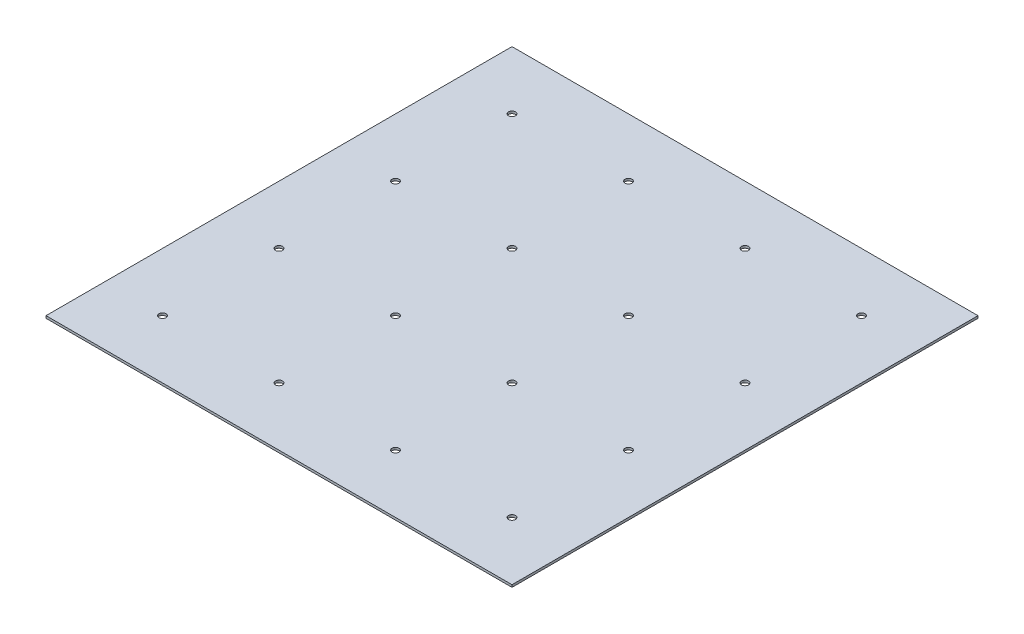
ISO-10303-21;
HEADER;
FILE_DESCRIPTION(('STEP AP214'),'2;1');
FILE_NAME('part.step','',(''),(''),'','','');
FILE_SCHEMA(('AUTOMOTIVE_DESIGN { 1 0 10303 214 1 1 1 1 }'));
ENDSEC;
DATA;
#1=APPLICATION_CONTEXT('core data for automotive mechanical design processes');
#2=APPLICATION_PROTOCOL_DEFINITION('international standard','automotive_design',2000,#1);
#3=PRODUCT_CONTEXT('',#1,'mechanical');
#4=PRODUCT('Part','Part','',(#3));
#5=PRODUCT_RELATED_PRODUCT_CATEGORY('part','',(#4));
#6=PRODUCT_DEFINITION_FORMATION('','',#4);
#7=PRODUCT_DEFINITION_CONTEXT('part definition',#1,'design');
#8=PRODUCT_DEFINITION('design','',#6,#7);
#9=PRODUCT_DEFINITION_SHAPE('','',#8);
#10=(LENGTH_UNIT() NAMED_UNIT(*) SI_UNIT(.MILLI.,.METRE.));
#11=(NAMED_UNIT(*) PLANE_ANGLE_UNIT() SI_UNIT($,.RADIAN.));
#12=(NAMED_UNIT(*) SI_UNIT($,.STERADIAN.) SOLID_ANGLE_UNIT());
#13=UNCERTAINTY_MEASURE_WITH_UNIT(LENGTH_MEASURE(1.E-05),#10,'distance_accuracy_value','');
#14=(GEOMETRIC_REPRESENTATION_CONTEXT(3) GLOBAL_UNCERTAINTY_ASSIGNED_CONTEXT((#13)) GLOBAL_UNIT_ASSIGNED_CONTEXT((#10,
#11,#12)) REPRESENTATION_CONTEXT('',''));
#15=CARTESIAN_POINT('',(0.,0.,0.));
#16=DIRECTION('',(0.,0.,1.));
#17=DIRECTION('',(1.,0.,0.));
#18=AXIS2_PLACEMENT_3D('',#15,#16,#17);
#19=CARTESIAN_POINT('',(200.,2.,-200.));
#20=DIRECTION('',(-1.,0.,0.));
#21=DIRECTION('',(0.,0.,1.));
#22=AXIS2_PLACEMENT_3D('',#19,#20,#21);
#23=PLANE('',#22);
#24=DIRECTION('',(0.,0.,-1.));
#25=VECTOR('',#24,1.);
#26=CARTESIAN_POINT('',(200.,0.,-200.));
#27=LINE('',#26,#25);
#28=CARTESIAN_POINT('',(200.,0.,200.));
#29=VERTEX_POINT('',#28);
#30=CARTESIAN_POINT('',(200.,0.,-200.));
#31=VERTEX_POINT('',#30);
#32=EDGE_CURVE('E99',#29,#31,#27,.T.);
#33=ORIENTED_EDGE('',*,*,#32,.T.);
#34=DIRECTION('',(0.,-1.,0.));
#35=VECTOR('',#34,1.);
#36=CARTESIAN_POINT('',(200.,2.,-200.));
#37=LINE('',#36,#35);
#38=CARTESIAN_POINT('',(200.,2.,-200.));
#39=VERTEX_POINT('',#38);
#40=EDGE_CURVE('E11',#39,#31,#37,.T.);
#41=ORIENTED_EDGE('',*,*,#40,.F.);
#42=DIRECTION('',(0.,0.,-1.));
#43=VECTOR('',#42,1.);
#44=CARTESIAN_POINT('',(200.,2.,-200.));
#45=LINE('',#44,#43);
#46=CARTESIAN_POINT('',(200.,2.,200.));
#47=VERTEX_POINT('',#46);
#48=EDGE_CURVE('E87',#47,#39,#45,.T.);
#49=ORIENTED_EDGE('',*,*,#48,.F.);
#50=DIRECTION('',(0.,-1.,0.));
#51=VECTOR('',#50,1.);
#52=CARTESIAN_POINT('',(200.,2.,200.));
#53=LINE('',#52,#51);
#54=EDGE_CURVE('E95',#47,#29,#53,.T.);
#55=ORIENTED_EDGE('',*,*,#54,.T.);
#56=EDGE_LOOP('',(#33,#41,#49,#55));
#57=FACE_BOUND('',#56,.T.);
#58=ADVANCED_FACE('F36',(#57),#23,.F.);
#59=CARTESIAN_POINT('',(-200.,2.,-200.));
#60=DIRECTION('',(0.,0.,1.));
#61=DIRECTION('',(1.,0.,0.));
#62=AXIS2_PLACEMENT_3D('',#59,#60,#61);
#63=PLANE('',#62);
#64=DIRECTION('',(-1.,0.,0.));
#65=VECTOR('',#64,1.);
#66=CARTESIAN_POINT('',(-200.,0.,-200.));
#67=LINE('',#66,#65);
#68=CARTESIAN_POINT('',(-200.,0.,-200.));
#69=VERTEX_POINT('',#68);
#70=EDGE_CURVE('E91',#31,#69,#67,.T.);
#71=ORIENTED_EDGE('',*,*,#70,.T.);
#72=DIRECTION('',(0.,-1.,0.));
#73=VECTOR('',#72,1.);
#74=CARTESIAN_POINT('',(-200.,2.,-200.));
#75=LINE('',#74,#73);
#76=CARTESIAN_POINT('',(-200.,2.,-200.));
#77=VERTEX_POINT('',#76);
#78=EDGE_CURVE('E44',#77,#69,#75,.T.);
#79=ORIENTED_EDGE('',*,*,#78,.F.);
#80=DIRECTION('',(-1.,0.,0.));
#81=VECTOR('',#80,1.);
#82=CARTESIAN_POINT('',(-200.,2.,-200.));
#83=LINE('',#82,#81);
#84=EDGE_CURVE('E82',#39,#77,#83,.T.);
#85=ORIENTED_EDGE('',*,*,#84,.F.);
#86=ORIENTED_EDGE('',*,*,#40,.T.);
#87=EDGE_LOOP('',(#71,#79,#85,#86));
#88=FACE_BOUND('',#87,.T.);
#89=ADVANCED_FACE('F90',(#88),#63,.F.);
#90=CARTESIAN_POINT('',(-200.,2.,-200.));
#91=DIRECTION('',(1.,0.,0.));
#92=DIRECTION('',(0.,0.,-1.));
#93=AXIS2_PLACEMENT_3D('',#90,#91,#92);
#94=PLANE('',#93);
#95=DIRECTION('',(0.,0.,1.));
#96=VECTOR('',#95,1.);
#97=CARTESIAN_POINT('',(-200.,0.,-200.));
#98=LINE('',#97,#96);
#99=CARTESIAN_POINT('',(-200.,0.,200.));
#100=VERTEX_POINT('',#99);
#101=EDGE_CURVE('E69',#69,#100,#98,.T.);
#102=ORIENTED_EDGE('',*,*,#101,.T.);
#103=DIRECTION('',(0.,-1.,0.));
#104=VECTOR('',#103,1.);
#105=CARTESIAN_POINT('',(-200.,2.,200.));
#106=LINE('',#105,#104);
#107=CARTESIAN_POINT('',(-200.,2.,200.));
#108=VERTEX_POINT('',#107);
#109=EDGE_CURVE('E92',#108,#100,#106,.T.);
#110=ORIENTED_EDGE('',*,*,#109,.F.);
#111=DIRECTION('',(0.,0.,1.));
#112=VECTOR('',#111,1.);
#113=CARTESIAN_POINT('',(-200.,2.,-200.));
#114=LINE('',#113,#112);
#115=EDGE_CURVE('E85',#77,#108,#114,.T.);
#116=ORIENTED_EDGE('',*,*,#115,.F.);
#117=ORIENTED_EDGE('',*,*,#78,.T.);
#118=EDGE_LOOP('',(#102,#110,#116,#117));
#119=FACE_BOUND('',#118,.T.);
#120=ADVANCED_FACE('F93',(#119),#94,.F.);
#121=CARTESIAN_POINT('',(-200.,2.,200.));
#122=DIRECTION('',(0.,0.,-1.));
#123=DIRECTION('',(-1.,0.,0.));
#124=AXIS2_PLACEMENT_3D('',#121,#122,#123);
#125=PLANE('',#124);
#126=DIRECTION('',(1.,0.,0.));
#127=VECTOR('',#126,1.);
#128=CARTESIAN_POINT('',(-200.,0.,200.));
#129=LINE('',#128,#127);
#130=EDGE_CURVE('E75',#100,#29,#129,.T.);
#131=ORIENTED_EDGE('',*,*,#130,.T.);
#132=ORIENTED_EDGE('',*,*,#54,.F.);
#133=DIRECTION('',(1.,0.,0.));
#134=VECTOR('',#133,1.);
#135=CARTESIAN_POINT('',(-200.,2.,200.));
#136=LINE('',#135,#134);
#137=EDGE_CURVE('E52',#108,#47,#136,.T.);
#138=ORIENTED_EDGE('',*,*,#137,.F.);
#139=ORIENTED_EDGE('',*,*,#109,.T.);
#140=EDGE_LOOP('',(#131,#132,#138,#139));
#141=FACE_BOUND('',#140,.T.);
#142=ADVANCED_FACE('F107',(#141),#125,.F.);
#143=CARTESIAN_POINT('',(0.,2.,0.));
#144=DIRECTION('',(0.,1.,0.));
#145=DIRECTION('',(0.,0.,1.));
#146=AXIS2_PLACEMENT_3D('',#143,#144,#145);
#147=PLANE('',#146);
#148=CARTESIAN_POINT('',(50.0000000000021,2.,50.));
#149=DIRECTION('',(0.,1.,0.));
#150=DIRECTION('',(0.,0.,1.));
#151=AXIS2_PLACEMENT_3D('',#148,#149,#150);
#152=CIRCLE('',#151,2.99999999999999);
#153=CARTESIAN_POINT('',(50.0000000000021,2.,53.));
#154=VERTEX_POINT('',#153);
#155=EDGE_CURVE('E143',#154,#154,#152,.T.);
#156=ORIENTED_EDGE('',*,*,#155,.F.);
#157=EDGE_LOOP('',(#156));
#158=FACE_BOUND('',#157,.T.);
#159=CARTESIAN_POINT('',(-49.9999999999979,2.,50.));
#160=DIRECTION('',(0.,1.,0.));
#161=DIRECTION('',(0.,0.,1.));
#162=AXIS2_PLACEMENT_3D('',#159,#160,#161);
#163=CIRCLE('',#162,2.99999999999999);
#164=CARTESIAN_POINT('',(-49.9999999999979,2.,53.));
#165=VERTEX_POINT('',#164);
#166=EDGE_CURVE('E150',#165,#165,#163,.T.);
#167=ORIENTED_EDGE('',*,*,#166,.F.);
#168=EDGE_LOOP('',(#167));
#169=FACE_BOUND('',#168,.T.);
#170=CARTESIAN_POINT('',(150.000000000001,2.,-50.));
#171=DIRECTION('',(0.,1.,0.));
#172=DIRECTION('',(0.,0.,1.));
#173=AXIS2_PLACEMENT_3D('',#170,#171,#172);
#174=CIRCLE('',#173,2.99999999999999);
#175=CARTESIAN_POINT('',(150.000000000001,2.,-47.));
#176=VERTEX_POINT('',#175);
#177=EDGE_CURVE('E156',#176,#176,#174,.T.);
#178=ORIENTED_EDGE('',*,*,#177,.F.);
#179=EDGE_LOOP('',(#178));
#180=FACE_BOUND('',#179,.T.);
#181=CARTESIAN_POINT('',(50.000000000001,2.,-50.));
#182=DIRECTION('',(0.,1.,0.));
#183=DIRECTION('',(0.,0.,1.));
#184=AXIS2_PLACEMENT_3D('',#181,#182,#183);
#185=CIRCLE('',#184,2.99999999999999);
#186=CARTESIAN_POINT('',(50.000000000001,2.,-47.));
#187=VERTEX_POINT('',#186);
#188=EDGE_CURVE('E162',#187,#187,#185,.T.);
#189=ORIENTED_EDGE('',*,*,#188,.F.);
#190=EDGE_LOOP('',(#189));
#191=FACE_BOUND('',#190,.T.);
#192=CARTESIAN_POINT('',(-50.,2.,-150.));
#193=DIRECTION('',(0.,1.,0.));
#194=DIRECTION('',(0.,0.,1.));
#195=AXIS2_PLACEMENT_3D('',#192,#193,#194);
#196=CIRCLE('',#195,2.99999999999999);
#197=CARTESIAN_POINT('',(-50.,2.,-147.));
#198=VERTEX_POINT('',#197);
#199=EDGE_CURVE('E126',#198,#198,#196,.T.);
#200=ORIENTED_EDGE('',*,*,#199,.F.);
#201=EDGE_LOOP('',(#200));
#202=FACE_BOUND('',#201,.T.);
#203=CARTESIAN_POINT('',(50.,2.,-150.));
#204=DIRECTION('',(0.,1.,0.));
#205=DIRECTION('',(0.,0.,1.));
#206=AXIS2_PLACEMENT_3D('',#203,#204,#205);
#207=CIRCLE('',#206,2.99999999999999);
#208=CARTESIAN_POINT('',(50.,2.,-147.));
#209=VERTEX_POINT('',#208);
#210=EDGE_CURVE('E119',#209,#209,#207,.T.);
#211=ORIENTED_EDGE('',*,*,#210,.F.);
#212=EDGE_LOOP('',(#211));
#213=FACE_BOUND('',#212,.T.);
#214=CARTESIAN_POINT('',(150.,2.,-150.));
#215=DIRECTION('',(0.,1.,0.));
#216=DIRECTION('',(0.,0.,1.));
#217=AXIS2_PLACEMENT_3D('',#214,#215,#216);
#218=CIRCLE('',#217,2.99999999999999);
#219=CARTESIAN_POINT('',(150.,2.,-147.));
#220=VERTEX_POINT('',#219);
#221=EDGE_CURVE('E138',#220,#220,#218,.T.);
#222=ORIENTED_EDGE('',*,*,#221,.F.);
#223=EDGE_LOOP('',(#222));
#224=FACE_BOUND('',#223,.T.);
#225=CARTESIAN_POINT('',(-49.999999999999,2.,-50.));
#226=DIRECTION('',(0.,1.,0.));
#227=DIRECTION('',(0.,0.,1.));
#228=AXIS2_PLACEMENT_3D('',#225,#226,#227);
#229=CIRCLE('',#228,2.99999999999999);
#230=CARTESIAN_POINT('',(-49.999999999999,2.,-47.));
#231=VERTEX_POINT('',#230);
#232=EDGE_CURVE('E131',#231,#231,#229,.T.);
#233=ORIENTED_EDGE('',*,*,#232,.F.);
#234=EDGE_LOOP('',(#233));
#235=FACE_BOUND('',#234,.T.);
#236=CARTESIAN_POINT('',(150.000000000003,2.,150.));
#237=DIRECTION('',(0.,1.,0.));
#238=DIRECTION('',(0.,0.,1.));
#239=AXIS2_PLACEMENT_3D('',#236,#237,#238);
#240=CIRCLE('',#239,2.99999999999999);
#241=CARTESIAN_POINT('',(150.000000000003,2.,153.));
#242=VERTEX_POINT('',#241);
#243=EDGE_CURVE('E185',#242,#242,#240,.T.);
#244=ORIENTED_EDGE('',*,*,#243,.F.);
#245=EDGE_LOOP('',(#244));
#246=FACE_BOUND('',#245,.T.);
#247=CARTESIAN_POINT('',(50.0000000000031,2.,150.));
#248=DIRECTION('',(0.,1.,0.));
#249=DIRECTION('',(0.,0.,1.));
#250=AXIS2_PLACEMENT_3D('',#247,#248,#249);
#251=CIRCLE('',#250,2.99999999999999);
#252=CARTESIAN_POINT('',(50.0000000000031,2.,153.));
#253=VERTEX_POINT('',#252);
#254=EDGE_CURVE('E203',#253,#253,#251,.T.);
#255=ORIENTED_EDGE('',*,*,#254,.F.);
#256=EDGE_LOOP('',(#255));
#257=FACE_BOUND('',#256,.T.);
#258=CARTESIAN_POINT('',(-49.9999999999969,2.,150.));
#259=DIRECTION('',(0.,1.,0.));
#260=DIRECTION('',(0.,0.,1.));
#261=AXIS2_PLACEMENT_3D('',#258,#259,#260);
#262=CIRCLE('',#261,2.99999999999999);
#263=CARTESIAN_POINT('',(-49.9999999999969,2.,153.));
#264=VERTEX_POINT('',#263);
#265=EDGE_CURVE('E186',#264,#264,#262,.T.);
#266=ORIENTED_EDGE('',*,*,#265,.F.);
#267=EDGE_LOOP('',(#266));
#268=FACE_BOUND('',#267,.T.);
#269=CARTESIAN_POINT('',(150.000000000002,2.,50.));
#270=DIRECTION('',(0.,1.,0.));
#271=DIRECTION('',(0.,0.,1.));
#272=AXIS2_PLACEMENT_3D('',#269,#270,#271);
#273=CIRCLE('',#272,2.99999999999999);
#274=CARTESIAN_POINT('',(150.000000000002,2.,53.));
#275=VERTEX_POINT('',#274);
#276=EDGE_CURVE('E193',#275,#275,#273,.T.);
#277=ORIENTED_EDGE('',*,*,#276,.F.);
#278=EDGE_LOOP('',(#277));
#279=FACE_BOUND('',#278,.T.);
#280=CARTESIAN_POINT('',(-149.999999999999,2.,-50.));
#281=DIRECTION('',(0.,1.,0.));
#282=DIRECTION('',(0.,0.,1.));
#283=AXIS2_PLACEMENT_3D('',#280,#281,#282);
#284=CIRCLE('',#283,2.99999999999999);
#285=CARTESIAN_POINT('',(-149.999999999999,2.,-47.));
#286=VERTEX_POINT('',#285);
#287=EDGE_CURVE('E179',#286,#286,#284,.T.);
#288=ORIENTED_EDGE('',*,*,#287,.F.);
#289=EDGE_LOOP('',(#288));
#290=FACE_BOUND('',#289,.T.);
#291=CARTESIAN_POINT('',(-149.999999999998,2.,50.));
#292=DIRECTION('',(0.,1.,0.));
#293=DIRECTION('',(0.,0.,1.));
#294=AXIS2_PLACEMENT_3D('',#291,#292,#293);
#295=CIRCLE('',#294,2.99999999999999);
#296=CARTESIAN_POINT('',(-149.999999999998,2.,53.));
#297=VERTEX_POINT('',#296);
#298=EDGE_CURVE('E173',#297,#297,#295,.T.);
#299=ORIENTED_EDGE('',*,*,#298,.F.);
#300=EDGE_LOOP('',(#299));
#301=FACE_BOUND('',#300,.T.);
#302=CARTESIAN_POINT('',(-149.999999999997,2.,150.));
#303=DIRECTION('',(0.,1.,0.));
#304=DIRECTION('',(0.,0.,1.));
#305=AXIS2_PLACEMENT_3D('',#302,#303,#304);
#306=CIRCLE('',#305,2.99999999999999);
#307=CARTESIAN_POINT('',(-149.999999999997,2.,153.));
#308=VERTEX_POINT('',#307);
#309=EDGE_CURVE('E167',#308,#308,#306,.T.);
#310=ORIENTED_EDGE('',*,*,#309,.F.);
#311=EDGE_LOOP('',(#310));
#312=FACE_BOUND('',#311,.T.);
#313=CARTESIAN_POINT('',(-150.,2.,-150.));
#314=DIRECTION('',(0.,1.,0.));
#315=DIRECTION('',(0.,0.,1.));
#316=AXIS2_PLACEMENT_3D('',#313,#314,#315);
#317=CIRCLE('',#316,2.99999999999999);
#318=CARTESIAN_POINT('',(-150.,2.,-147.));
#319=VERTEX_POINT('',#318);
#320=EDGE_CURVE('E113',#319,#319,#317,.T.);
#321=ORIENTED_EDGE('',*,*,#320,.F.);
#322=EDGE_LOOP('',(#321));
#323=FACE_BOUND('',#322,.T.);
#324=ORIENTED_EDGE('',*,*,#48,.T.);
#325=ORIENTED_EDGE('',*,*,#84,.T.);
#326=ORIENTED_EDGE('',*,*,#115,.T.);
#327=ORIENTED_EDGE('',*,*,#137,.T.);
#328=EDGE_LOOP('',(#324,#325,#326,#327));
#329=FACE_BOUND('',#328,.T.);
#330=ADVANCED_FACE('F83',(#158,#169,#180,#191,#202,#213,#224,#235,#246,#257,#268,#279,#290,#301,
#312,#323,#329),#147,.T.);
#331=CARTESIAN_POINT('',(0.,0.,0.));
#332=DIRECTION('',(0.,1.,0.));
#333=DIRECTION('',(0.,0.,1.));
#334=AXIS2_PLACEMENT_3D('',#331,#332,#333);
#335=PLANE('',#334);
#336=CARTESIAN_POINT('',(50.0000000000021,0.,50.));
#337=DIRECTION('',(0.,1.,0.));
#338=DIRECTION('',(0.,0.,1.));
#339=AXIS2_PLACEMENT_3D('',#336,#337,#338);
#340=CIRCLE('',#339,2.99999999999999);
#341=CARTESIAN_POINT('',(50.0000000000021,0.,53.));
#342=VERTEX_POINT('',#341);
#343=EDGE_CURVE('E146',#342,#342,#340,.T.);
#344=ORIENTED_EDGE('',*,*,#343,.T.);
#345=EDGE_LOOP('',(#344));
#346=FACE_BOUND('',#345,.T.);
#347=CARTESIAN_POINT('',(-49.9999999999979,0.,50.));
#348=DIRECTION('',(0.,1.,0.));
#349=DIRECTION('',(0.,0.,1.));
#350=AXIS2_PLACEMENT_3D('',#347,#348,#349);
#351=CIRCLE('',#350,2.99999999999999);
#352=CARTESIAN_POINT('',(-49.9999999999979,0.,53.));
#353=VERTEX_POINT('',#352);
#354=EDGE_CURVE('E153',#353,#353,#351,.T.);
#355=ORIENTED_EDGE('',*,*,#354,.T.);
#356=EDGE_LOOP('',(#355));
#357=FACE_BOUND('',#356,.T.);
#358=CARTESIAN_POINT('',(150.000000000001,0.,-50.));
#359=DIRECTION('',(0.,1.,0.));
#360=DIRECTION('',(0.,0.,1.));
#361=AXIS2_PLACEMENT_3D('',#358,#359,#360);
#362=CIRCLE('',#361,2.99999999999999);
#363=CARTESIAN_POINT('',(150.000000000001,0.,-47.));
#364=VERTEX_POINT('',#363);
#365=EDGE_CURVE('E159',#364,#364,#362,.T.);
#366=ORIENTED_EDGE('',*,*,#365,.T.);
#367=EDGE_LOOP('',(#366));
#368=FACE_BOUND('',#367,.T.);
#369=CARTESIAN_POINT('',(50.000000000001,0.,-50.));
#370=DIRECTION('',(0.,1.,0.));
#371=DIRECTION('',(0.,0.,1.));
#372=AXIS2_PLACEMENT_3D('',#369,#370,#371);
#373=CIRCLE('',#372,2.99999999999999);
#374=CARTESIAN_POINT('',(50.000000000001,0.,-47.));
#375=VERTEX_POINT('',#374);
#376=EDGE_CURVE('E135',#375,#375,#373,.T.);
#377=ORIENTED_EDGE('',*,*,#376,.T.);
#378=EDGE_LOOP('',(#377));
#379=FACE_BOUND('',#378,.T.);
#380=CARTESIAN_POINT('',(-50.,0.,-150.));
#381=DIRECTION('',(0.,1.,0.));
#382=DIRECTION('',(0.,0.,1.));
#383=AXIS2_PLACEMENT_3D('',#380,#381,#382);
#384=CIRCLE('',#383,2.99999999999999);
#385=CARTESIAN_POINT('',(-50.,0.,-147.));
#386=VERTEX_POINT('',#385);
#387=EDGE_CURVE('E116',#386,#386,#384,.T.);
#388=ORIENTED_EDGE('',*,*,#387,.T.);
#389=EDGE_LOOP('',(#388));
#390=FACE_BOUND('',#389,.T.);
#391=CARTESIAN_POINT('',(50.,0.,-150.));
#392=DIRECTION('',(0.,1.,0.));
#393=DIRECTION('',(0.,0.,1.));
#394=AXIS2_PLACEMENT_3D('',#391,#392,#393);
#395=CIRCLE('',#394,2.99999999999999);
#396=CARTESIAN_POINT('',(50.,0.,-147.));
#397=VERTEX_POINT('',#396);
#398=EDGE_CURVE('E122',#397,#397,#395,.T.);
#399=ORIENTED_EDGE('',*,*,#398,.T.);
#400=EDGE_LOOP('',(#399));
#401=FACE_BOUND('',#400,.T.);
#402=CARTESIAN_POINT('',(150.,0.,-150.));
#403=DIRECTION('',(0.,1.,0.));
#404=DIRECTION('',(0.,0.,1.));
#405=AXIS2_PLACEMENT_3D('',#402,#403,#404);
#406=CIRCLE('',#405,2.99999999999999);
#407=CARTESIAN_POINT('',(150.,0.,-147.));
#408=VERTEX_POINT('',#407);
#409=EDGE_CURVE('E123',#408,#408,#406,.T.);
#410=ORIENTED_EDGE('',*,*,#409,.T.);
#411=EDGE_LOOP('',(#410));
#412=FACE_BOUND('',#411,.T.);
#413=CARTESIAN_POINT('',(-49.999999999999,0.,-50.));
#414=DIRECTION('',(0.,1.,0.));
#415=DIRECTION('',(0.,0.,1.));
#416=AXIS2_PLACEMENT_3D('',#413,#414,#415);
#417=CIRCLE('',#416,2.99999999999999);
#418=CARTESIAN_POINT('',(-49.999999999999,0.,-47.));
#419=VERTEX_POINT('',#418);
#420=EDGE_CURVE('E134',#419,#419,#417,.T.);
#421=ORIENTED_EDGE('',*,*,#420,.T.);
#422=EDGE_LOOP('',(#421));
#423=FACE_BOUND('',#422,.T.);
#424=CARTESIAN_POINT('',(150.000000000003,0.,150.));
#425=DIRECTION('',(0.,1.,0.));
#426=DIRECTION('',(0.,0.,1.));
#427=AXIS2_PLACEMENT_3D('',#424,#425,#426);
#428=CIRCLE('',#427,2.99999999999999);
#429=CARTESIAN_POINT('',(150.000000000003,0.,153.));
#430=VERTEX_POINT('',#429);
#431=EDGE_CURVE('E200',#430,#430,#428,.T.);
#432=ORIENTED_EDGE('',*,*,#431,.T.);
#433=EDGE_LOOP('',(#432));
#434=FACE_BOUND('',#433,.T.);
#435=CARTESIAN_POINT('',(50.0000000000031,0.,150.));
#436=DIRECTION('',(0.,1.,0.));
#437=DIRECTION('',(0.,0.,1.));
#438=AXIS2_PLACEMENT_3D('',#435,#436,#437);
#439=CIRCLE('',#438,2.99999999999999);
#440=CARTESIAN_POINT('',(50.0000000000031,0.,153.));
#441=VERTEX_POINT('',#440);
#442=EDGE_CURVE('E190',#441,#441,#439,.T.);
#443=ORIENTED_EDGE('',*,*,#442,.T.);
#444=EDGE_LOOP('',(#443));
#445=FACE_BOUND('',#444,.T.);
#446=CARTESIAN_POINT('',(-49.9999999999969,0.,150.));
#447=DIRECTION('',(0.,1.,0.));
#448=DIRECTION('',(0.,0.,1.));
#449=AXIS2_PLACEMENT_3D('',#446,#447,#448);
#450=CIRCLE('',#449,2.99999999999999);
#451=CARTESIAN_POINT('',(-49.9999999999969,0.,153.));
#452=VERTEX_POINT('',#451);
#453=EDGE_CURVE('E189',#452,#452,#450,.T.);
#454=ORIENTED_EDGE('',*,*,#453,.T.);
#455=EDGE_LOOP('',(#454));
#456=FACE_BOUND('',#455,.T.);
#457=CARTESIAN_POINT('',(150.000000000002,0.,50.));
#458=DIRECTION('',(0.,1.,0.));
#459=DIRECTION('',(0.,0.,1.));
#460=AXIS2_PLACEMENT_3D('',#457,#458,#459);
#461=CIRCLE('',#460,2.99999999999999);
#462=CARTESIAN_POINT('',(150.000000000002,0.,53.));
#463=VERTEX_POINT('',#462);
#464=EDGE_CURVE('E147',#463,#463,#461,.T.);
#465=ORIENTED_EDGE('',*,*,#464,.T.);
#466=EDGE_LOOP('',(#465));
#467=FACE_BOUND('',#466,.T.);
#468=CARTESIAN_POINT('',(-149.999999999999,0.,-50.));
#469=DIRECTION('',(0.,1.,0.));
#470=DIRECTION('',(0.,0.,1.));
#471=AXIS2_PLACEMENT_3D('',#468,#469,#470);
#472=CIRCLE('',#471,2.99999999999999);
#473=CARTESIAN_POINT('',(-149.999999999999,0.,-47.));
#474=VERTEX_POINT('',#473);
#475=EDGE_CURVE('E182',#474,#474,#472,.T.);
#476=ORIENTED_EDGE('',*,*,#475,.T.);
#477=EDGE_LOOP('',(#476));
#478=FACE_BOUND('',#477,.T.);
#479=CARTESIAN_POINT('',(-149.999999999998,0.,50.));
#480=DIRECTION('',(0.,1.,0.));
#481=DIRECTION('',(0.,0.,1.));
#482=AXIS2_PLACEMENT_3D('',#479,#480,#481);
#483=CIRCLE('',#482,2.99999999999999);
#484=CARTESIAN_POINT('',(-149.999999999998,0.,53.));
#485=VERTEX_POINT('',#484);
#486=EDGE_CURVE('E176',#485,#485,#483,.T.);
#487=ORIENTED_EDGE('',*,*,#486,.T.);
#488=EDGE_LOOP('',(#487));
#489=FACE_BOUND('',#488,.T.);
#490=CARTESIAN_POINT('',(-149.999999999997,0.,150.));
#491=DIRECTION('',(0.,1.,0.));
#492=DIRECTION('',(0.,0.,1.));
#493=AXIS2_PLACEMENT_3D('',#490,#491,#492);
#494=CIRCLE('',#493,2.99999999999999);
#495=CARTESIAN_POINT('',(-149.999999999997,0.,153.));
#496=VERTEX_POINT('',#495);
#497=EDGE_CURVE('E170',#496,#496,#494,.T.);
#498=ORIENTED_EDGE('',*,*,#497,.T.);
#499=EDGE_LOOP('',(#498));
#500=FACE_BOUND('',#499,.T.);
#501=CARTESIAN_POINT('',(-150.,0.,-150.));
#502=DIRECTION('',(0.,1.,0.));
#503=DIRECTION('',(0.,0.,1.));
#504=AXIS2_PLACEMENT_3D('',#501,#502,#503);
#505=CIRCLE('',#504,2.99999999999999);
#506=CARTESIAN_POINT('',(-150.,0.,-147.));
#507=VERTEX_POINT('',#506);
#508=EDGE_CURVE('E102',#507,#507,#505,.T.);
#509=ORIENTED_EDGE('',*,*,#508,.T.);
#510=EDGE_LOOP('',(#509));
#511=FACE_BOUND('',#510,.T.);
#512=ORIENTED_EDGE('',*,*,#32,.F.);
#513=ORIENTED_EDGE('',*,*,#130,.F.);
#514=ORIENTED_EDGE('',*,*,#101,.F.);
#515=ORIENTED_EDGE('',*,*,#70,.F.);
#516=EDGE_LOOP('',(#512,#513,#514,#515));
#517=FACE_BOUND('',#516,.T.);
#518=ADVANCED_FACE('F110',(#346,#357,#368,#379,#390,#401,#412,#423,#434,#445,#456,#467,#478,
#489,#500,#511,#517),#335,.F.);
#519=CARTESIAN_POINT('',(-150.,0.,-150.));
#520=DIRECTION('',(0.,1.,0.));
#521=DIRECTION('',(0.,0.,1.));
#522=AXIS2_PLACEMENT_3D('',#519,#520,#521);
#523=CYLINDRICAL_SURFACE('',#522,2.99999999999999);
#524=ORIENTED_EDGE('',*,*,#508,.F.);
#525=EDGE_LOOP('',(#524));
#526=FACE_BOUND('',#525,.T.);
#527=ORIENTED_EDGE('',*,*,#320,.T.);
#528=EDGE_LOOP('',(#527));
#529=FACE_BOUND('',#528,.T.);
#530=ADVANCED_FACE('F235',(#526,#529),#523,.F.);
#531=CARTESIAN_POINT('',(-149.999999999997,0.,150.));
#532=DIRECTION('',(0.,1.,0.));
#533=DIRECTION('',(0.,0.,1.));
#534=AXIS2_PLACEMENT_3D('',#531,#532,#533);
#535=CYLINDRICAL_SURFACE('',#534,2.99999999999999);
#536=ORIENTED_EDGE('',*,*,#497,.F.);
#537=EDGE_LOOP('',(#536));
#538=FACE_BOUND('',#537,.T.);
#539=ORIENTED_EDGE('',*,*,#309,.T.);
#540=EDGE_LOOP('',(#539));
#541=FACE_BOUND('',#540,.T.);
#542=ADVANCED_FACE('F237',(#538,#541),#535,.F.);
#543=CARTESIAN_POINT('',(-149.999999999998,0.,50.));
#544=DIRECTION('',(0.,1.,0.));
#545=DIRECTION('',(0.,0.,1.));
#546=AXIS2_PLACEMENT_3D('',#543,#544,#545);
#547=CYLINDRICAL_SURFACE('',#546,2.99999999999999);
#548=ORIENTED_EDGE('',*,*,#486,.F.);
#549=EDGE_LOOP('',(#548));
#550=FACE_BOUND('',#549,.T.);
#551=ORIENTED_EDGE('',*,*,#298,.T.);
#552=EDGE_LOOP('',(#551));
#553=FACE_BOUND('',#552,.T.);
#554=ADVANCED_FACE('F244',(#550,#553),#547,.F.);
#555=CARTESIAN_POINT('',(-149.999999999999,0.,-50.));
#556=DIRECTION('',(0.,1.,0.));
#557=DIRECTION('',(0.,0.,1.));
#558=AXIS2_PLACEMENT_3D('',#555,#556,#557);
#559=CYLINDRICAL_SURFACE('',#558,2.99999999999999);
#560=ORIENTED_EDGE('',*,*,#475,.F.);
#561=EDGE_LOOP('',(#560));
#562=FACE_BOUND('',#561,.T.);
#563=ORIENTED_EDGE('',*,*,#287,.T.);
#564=EDGE_LOOP('',(#563));
#565=FACE_BOUND('',#564,.T.);
#566=ADVANCED_FACE('F292',(#562,#565),#559,.F.);
#567=CARTESIAN_POINT('',(150.000000000002,0.,50.));
#568=DIRECTION('',(0.,1.,0.));
#569=DIRECTION('',(0.,0.,1.));
#570=AXIS2_PLACEMENT_3D('',#567,#568,#569);
#571=CYLINDRICAL_SURFACE('',#570,2.99999999999999);
#572=ORIENTED_EDGE('',*,*,#464,.F.);
#573=EDGE_LOOP('',(#572));
#574=FACE_BOUND('',#573,.T.);
#575=ORIENTED_EDGE('',*,*,#276,.T.);
#576=EDGE_LOOP('',(#575));
#577=FACE_BOUND('',#576,.T.);
#578=ADVANCED_FACE('F302',(#574,#577),#571,.F.);
#579=CARTESIAN_POINT('',(-49.9999999999969,0.,150.));
#580=DIRECTION('',(0.,1.,0.));
#581=DIRECTION('',(0.,0.,1.));
#582=AXIS2_PLACEMENT_3D('',#579,#580,#581);
#583=CYLINDRICAL_SURFACE('',#582,2.99999999999999);
#584=ORIENTED_EDGE('',*,*,#453,.F.);
#585=EDGE_LOOP('',(#584));
#586=FACE_BOUND('',#585,.T.);
#587=ORIENTED_EDGE('',*,*,#265,.T.);
#588=EDGE_LOOP('',(#587));
#589=FACE_BOUND('',#588,.T.);
#590=ADVANCED_FACE('F215',(#586,#589),#583,.F.);
#591=CARTESIAN_POINT('',(50.0000000000031,0.,150.));
#592=DIRECTION('',(0.,1.,0.));
#593=DIRECTION('',(0.,0.,1.));
#594=AXIS2_PLACEMENT_3D('',#591,#592,#593);
#595=CYLINDRICAL_SURFACE('',#594,2.99999999999999);
#596=ORIENTED_EDGE('',*,*,#442,.F.);
#597=EDGE_LOOP('',(#596));
#598=FACE_BOUND('',#597,.T.);
#599=ORIENTED_EDGE('',*,*,#254,.T.);
#600=EDGE_LOOP('',(#599));
#601=FACE_BOUND('',#600,.T.);
#602=ADVANCED_FACE('F211',(#598,#601),#595,.F.);
#603=CARTESIAN_POINT('',(150.000000000003,0.,150.));
#604=DIRECTION('',(0.,1.,0.));
#605=DIRECTION('',(0.,0.,1.));
#606=AXIS2_PLACEMENT_3D('',#603,#604,#605);
#607=CYLINDRICAL_SURFACE('',#606,2.99999999999999);
#608=ORIENTED_EDGE('',*,*,#431,.F.);
#609=EDGE_LOOP('',(#608));
#610=FACE_BOUND('',#609,.T.);
#611=ORIENTED_EDGE('',*,*,#243,.T.);
#612=EDGE_LOOP('',(#611));
#613=FACE_BOUND('',#612,.T.);
#614=ADVANCED_FACE('F214',(#610,#613),#607,.F.);
#615=CARTESIAN_POINT('',(-49.999999999999,0.,-50.));
#616=DIRECTION('',(0.,1.,0.));
#617=DIRECTION('',(0.,0.,1.));
#618=AXIS2_PLACEMENT_3D('',#615,#616,#617);
#619=CYLINDRICAL_SURFACE('',#618,2.99999999999999);
#620=ORIENTED_EDGE('',*,*,#420,.F.);
#621=EDGE_LOOP('',(#620));
#622=FACE_BOUND('',#621,.T.);
#623=ORIENTED_EDGE('',*,*,#232,.T.);
#624=EDGE_LOOP('',(#623));
#625=FACE_BOUND('',#624,.T.);
#626=ADVANCED_FACE('F336',(#622,#625),#619,.F.);
#627=CARTESIAN_POINT('',(150.,0.,-150.));
#628=DIRECTION('',(0.,1.,0.));
#629=DIRECTION('',(0.,0.,1.));
#630=AXIS2_PLACEMENT_3D('',#627,#628,#629);
#631=CYLINDRICAL_SURFACE('',#630,2.99999999999999);
#632=ORIENTED_EDGE('',*,*,#409,.F.);
#633=EDGE_LOOP('',(#632));
#634=FACE_BOUND('',#633,.T.);
#635=ORIENTED_EDGE('',*,*,#221,.T.);
#636=EDGE_LOOP('',(#635));
#637=FACE_BOUND('',#636,.T.);
#638=ADVANCED_FACE('F346',(#634,#637),#631,.F.);
#639=CARTESIAN_POINT('',(50.,0.,-150.));
#640=DIRECTION('',(0.,1.,0.));
#641=DIRECTION('',(0.,0.,1.));
#642=AXIS2_PLACEMENT_3D('',#639,#640,#641);
#643=CYLINDRICAL_SURFACE('',#642,2.99999999999999);
#644=ORIENTED_EDGE('',*,*,#398,.F.);
#645=EDGE_LOOP('',(#644));
#646=FACE_BOUND('',#645,.T.);
#647=ORIENTED_EDGE('',*,*,#210,.T.);
#648=EDGE_LOOP('',(#647));
#649=FACE_BOUND('',#648,.T.);
#650=ADVANCED_FACE('F356',(#646,#649),#643,.F.);
#651=CARTESIAN_POINT('',(-50.,0.,-150.));
#652=DIRECTION('',(0.,1.,0.));
#653=DIRECTION('',(0.,0.,1.));
#654=AXIS2_PLACEMENT_3D('',#651,#652,#653);
#655=CYLINDRICAL_SURFACE('',#654,2.99999999999999);
#656=ORIENTED_EDGE('',*,*,#387,.F.);
#657=EDGE_LOOP('',(#656));
#658=FACE_BOUND('',#657,.T.);
#659=ORIENTED_EDGE('',*,*,#199,.T.);
#660=EDGE_LOOP('',(#659));
#661=FACE_BOUND('',#660,.T.);
#662=ADVANCED_FACE('F366',(#658,#661),#655,.F.);
#663=CARTESIAN_POINT('',(50.000000000001,0.,-50.));
#664=DIRECTION('',(0.,1.,0.));
#665=DIRECTION('',(0.,0.,1.));
#666=AXIS2_PLACEMENT_3D('',#663,#664,#665);
#667=CYLINDRICAL_SURFACE('',#666,2.99999999999999);
#668=ORIENTED_EDGE('',*,*,#376,.F.);
#669=EDGE_LOOP('',(#668));
#670=FACE_BOUND('',#669,.T.);
#671=ORIENTED_EDGE('',*,*,#188,.T.);
#672=EDGE_LOOP('',(#671));
#673=FACE_BOUND('',#672,.T.);
#674=ADVANCED_FACE('F375',(#670,#673),#667,.F.);
#675=CARTESIAN_POINT('',(150.000000000001,0.,-50.));
#676=DIRECTION('',(0.,1.,0.));
#677=DIRECTION('',(0.,0.,1.));
#678=AXIS2_PLACEMENT_3D('',#675,#676,#677);
#679=CYLINDRICAL_SURFACE('',#678,2.99999999999999);
#680=ORIENTED_EDGE('',*,*,#365,.F.);
#681=EDGE_LOOP('',(#680));
#682=FACE_BOUND('',#681,.T.);
#683=ORIENTED_EDGE('',*,*,#177,.T.);
#684=EDGE_LOOP('',(#683));
#685=FACE_BOUND('',#684,.T.);
#686=ADVANCED_FACE('F385',(#682,#685),#679,.F.);
#687=CARTESIAN_POINT('',(-49.9999999999979,0.,50.));
#688=DIRECTION('',(0.,1.,0.));
#689=DIRECTION('',(0.,0.,1.));
#690=AXIS2_PLACEMENT_3D('',#687,#688,#689);
#691=CYLINDRICAL_SURFACE('',#690,2.99999999999999);
#692=ORIENTED_EDGE('',*,*,#354,.F.);
#693=EDGE_LOOP('',(#692));
#694=FACE_BOUND('',#693,.T.);
#695=ORIENTED_EDGE('',*,*,#166,.T.);
#696=EDGE_LOOP('',(#695));
#697=FACE_BOUND('',#696,.T.);
#698=ADVANCED_FACE('F395',(#694,#697),#691,.F.);
#699=CARTESIAN_POINT('',(50.0000000000021,0.,50.));
#700=DIRECTION('',(0.,1.,0.));
#701=DIRECTION('',(0.,0.,1.));
#702=AXIS2_PLACEMENT_3D('',#699,#700,#701);
#703=CYLINDRICAL_SURFACE('',#702,2.99999999999999);
#704=ORIENTED_EDGE('',*,*,#343,.F.);
#705=EDGE_LOOP('',(#704));
#706=FACE_BOUND('',#705,.T.);
#707=ORIENTED_EDGE('',*,*,#155,.T.);
#708=EDGE_LOOP('',(#707));
#709=FACE_BOUND('',#708,.T.);
#710=ADVANCED_FACE('F405',(#706,#709),#703,.F.);
#711=CLOSED_SHELL('',(#58,#89,#120,#142,#330,#518,#530,#542,#554,#566,#578,#590,#602,#614,#626,
#638,#650,#662,#674,#686,#698,#710));
#712=MANIFOLD_SOLID_BREP('B2',#711);
#713=ADVANCED_BREP_SHAPE_REPRESENTATION('',(#18,#712),#14);
#714=SHAPE_DEFINITION_REPRESENTATION(#9,#713);
ENDSEC;
END-ISO-10303-21;
